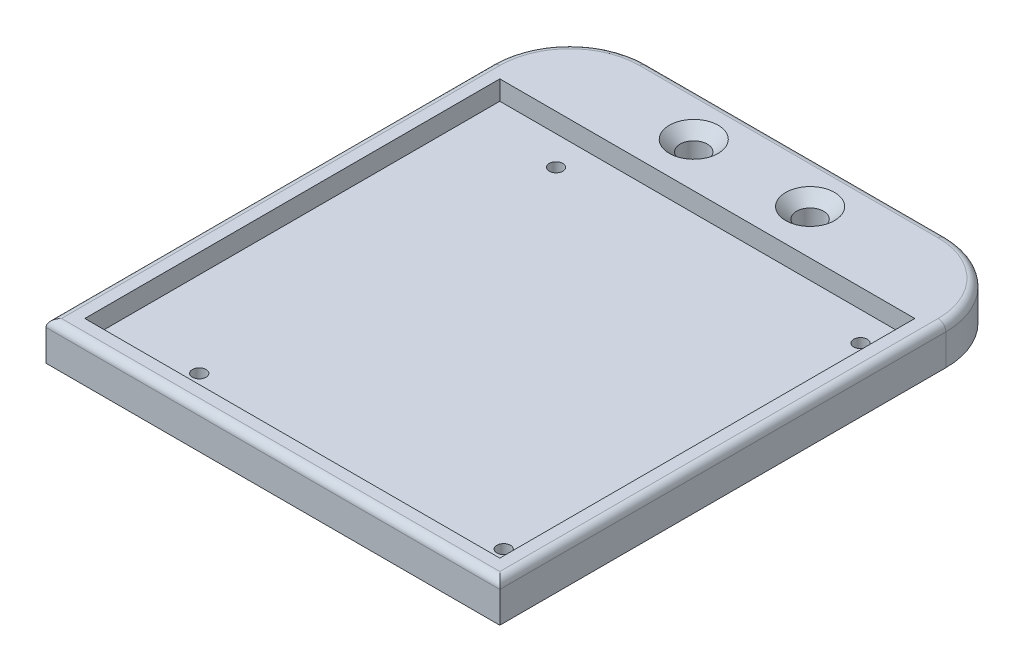
ISO-10303-21;
HEADER;
FILE_DESCRIPTION(('STEP AP214'),'2;1');
FILE_NAME('part.step','',(''),(''),'','','');
FILE_SCHEMA(('AUTOMOTIVE_DESIGN { 1 0 10303 214 1 1 1 1 }'));
ENDSEC;
DATA;
#1=APPLICATION_CONTEXT('core data for automotive mechanical design processes');
#2=APPLICATION_PROTOCOL_DEFINITION('international standard','automotive_design',2000,#1);
#3=PRODUCT_CONTEXT('',#1,'mechanical');
#4=PRODUCT('Part','Part','',(#3));
#5=PRODUCT_RELATED_PRODUCT_CATEGORY('part','',(#4));
#6=PRODUCT_DEFINITION_FORMATION('','',#4);
#7=PRODUCT_DEFINITION_CONTEXT('part definition',#1,'design');
#8=PRODUCT_DEFINITION('design','',#6,#7);
#9=PRODUCT_DEFINITION_SHAPE('','',#8);
#10=(LENGTH_UNIT() NAMED_UNIT(*) SI_UNIT(.MILLI.,.METRE.));
#11=(NAMED_UNIT(*) PLANE_ANGLE_UNIT() SI_UNIT($,.RADIAN.));
#12=(NAMED_UNIT(*) SI_UNIT($,.STERADIAN.) SOLID_ANGLE_UNIT());
#13=UNCERTAINTY_MEASURE_WITH_UNIT(LENGTH_MEASURE(1.E-05),#10,'distance_accuracy_value','');
#14=(GEOMETRIC_REPRESENTATION_CONTEXT(3) GLOBAL_UNCERTAINTY_ASSIGNED_CONTEXT((#13)) GLOBAL_UNIT_ASSIGNED_CONTEXT((#10,
#11,#12)) REPRESENTATION_CONTEXT('',''));
#15=CARTESIAN_POINT('',(0.,0.,0.));
#16=DIRECTION('',(0.,0.,1.));
#17=DIRECTION('',(1.,0.,0.));
#18=AXIS2_PLACEMENT_3D('',#15,#16,#17);
#19=CARTESIAN_POINT('',(58.5,10.,-67.5));
#20=DIRECTION('',(-1.,0.,0.));
#21=DIRECTION('',(0.,0.,1.));
#22=AXIS2_PLACEMENT_3D('',#19,#20,#21);
#23=PLANE('',#22);
#24=DIRECTION('',(0.,-1.,0.));
#25=VECTOR('',#24,1.);
#26=CARTESIAN_POINT('',(58.5,10.,-47.5));
#27=LINE('',#26,#25);
#28=CARTESIAN_POINT('',(58.5,0.,-47.5));
#29=VERTEX_POINT('',#28);
#30=CARTESIAN_POINT('',(58.5,8.,-47.5));
#31=VERTEX_POINT('',#30);
#32=EDGE_CURVE('E199',#29,#31,#27,.F.);
#33=ORIENTED_EDGE('',*,*,#32,.T.);
#34=DIRECTION('',(0.,0.,-1.));
#35=VECTOR('',#34,1.);
#36=CARTESIAN_POINT('',(58.5,8.,67.5));
#37=LINE('',#36,#35);
#38=CARTESIAN_POINT('',(58.5,8.,67.5));
#39=VERTEX_POINT('',#38);
#40=EDGE_CURVE('E217',#31,#39,#37,.F.);
#41=ORIENTED_EDGE('',*,*,#40,.T.);
#42=DIRECTION('',(0.,-1.,0.));
#43=VECTOR('',#42,1.);
#44=CARTESIAN_POINT('',(58.5,10.,67.5));
#45=LINE('',#44,#43);
#46=CARTESIAN_POINT('',(58.5,0.,67.5));
#47=VERTEX_POINT('',#46);
#48=EDGE_CURVE('E186',#39,#47,#45,.T.);
#49=ORIENTED_EDGE('',*,*,#48,.T.);
#50=DIRECTION('',(0.,0.,-1.));
#51=VECTOR('',#50,1.);
#52=CARTESIAN_POINT('',(58.5,0.,-67.5));
#53=LINE('',#52,#51);
#54=EDGE_CURVE('E171',#47,#29,#53,.T.);
#55=ORIENTED_EDGE('',*,*,#54,.T.);
#56=EDGE_LOOP('',(#33,#41,#49,#55));
#57=FACE_BOUND('',#56,.T.);
#58=ADVANCED_FACE('F33',(#57),#23,.F.);
#59=CARTESIAN_POINT('',(-58.5,10.,-67.5));
#60=DIRECTION('',(0.,0.,1.));
#61=DIRECTION('',(1.,0.,0.));
#62=AXIS2_PLACEMENT_3D('',#59,#60,#61);
#63=PLANE('',#62);
#64=DIRECTION('',(0.,-1.,0.));
#65=VECTOR('',#64,1.);
#66=CARTESIAN_POINT('',(-38.5,10.,-67.5));
#67=LINE('',#66,#65);
#68=CARTESIAN_POINT('',(-38.5,0.,-67.5));
#69=VERTEX_POINT('',#68);
#70=CARTESIAN_POINT('',(-38.5,8.,-67.5));
#71=VERTEX_POINT('',#70);
#72=EDGE_CURVE('E190',#69,#71,#67,.F.);
#73=ORIENTED_EDGE('',*,*,#72,.T.);
#74=DIRECTION('',(-1.,0.,0.));
#75=VECTOR('',#74,1.);
#76=CARTESIAN_POINT('',(38.5,8.,-67.5));
#77=LINE('',#76,#75);
#78=CARTESIAN_POINT('',(38.5,8.,-67.5));
#79=VERTEX_POINT('',#78);
#80=EDGE_CURVE('E222',#71,#79,#77,.F.);
#81=ORIENTED_EDGE('',*,*,#80,.T.);
#82=DIRECTION('',(0.,-1.,0.));
#83=VECTOR('',#82,1.);
#84=CARTESIAN_POINT('',(38.5,10.,-67.5));
#85=LINE('',#84,#83);
#86=CARTESIAN_POINT('',(38.5,0.,-67.5));
#87=VERTEX_POINT('',#86);
#88=EDGE_CURVE('E193',#79,#87,#85,.T.);
#89=ORIENTED_EDGE('',*,*,#88,.T.);
#90=DIRECTION('',(-1.,0.,0.));
#91=VECTOR('',#90,1.);
#92=CARTESIAN_POINT('',(-58.5,0.,-67.5));
#93=LINE('',#92,#91);
#94=EDGE_CURVE('E177',#87,#69,#93,.T.);
#95=ORIENTED_EDGE('',*,*,#94,.T.);
#96=EDGE_LOOP('',(#73,#81,#89,#95));
#97=FACE_BOUND('',#96,.T.);
#98=ADVANCED_FACE('F308',(#97),#63,.F.);
#99=CARTESIAN_POINT('',(-58.5,10.,-67.5));
#100=DIRECTION('',(1.,0.,0.));
#101=DIRECTION('',(0.,0.,-1.));
#102=AXIS2_PLACEMENT_3D('',#99,#100,#101);
#103=PLANE('',#102);
#104=DIRECTION('',(0.,-1.,0.));
#105=VECTOR('',#104,1.);
#106=CARTESIAN_POINT('',(-58.5,10.,67.5));
#107=LINE('',#106,#105);
#108=CARTESIAN_POINT('',(-58.5,8.,67.5));
#109=VERTEX_POINT('',#108);
#110=CARTESIAN_POINT('',(-58.5,0.,67.5));
#111=VERTEX_POINT('',#110);
#112=EDGE_CURVE('E188',#109,#111,#107,.T.);
#113=ORIENTED_EDGE('',*,*,#112,.F.);
#114=DIRECTION('',(0.,0.,1.));
#115=VECTOR('',#114,1.);
#116=CARTESIAN_POINT('',(-58.5,8.,-47.5));
#117=LINE('',#116,#115);
#118=CARTESIAN_POINT('',(-58.5,8.,-47.5));
#119=VERTEX_POINT('',#118);
#120=EDGE_CURVE('E11',#109,#119,#117,.F.);
#121=ORIENTED_EDGE('',*,*,#120,.T.);
#122=DIRECTION('',(0.,-1.,0.));
#123=VECTOR('',#122,1.);
#124=CARTESIAN_POINT('',(-58.5,10.,-47.5));
#125=LINE('',#124,#123);
#126=CARTESIAN_POINT('',(-58.5,0.,-47.5));
#127=VERTEX_POINT('',#126);
#128=EDGE_CURVE('E202',#119,#127,#125,.T.);
#129=ORIENTED_EDGE('',*,*,#128,.T.);
#130=DIRECTION('',(0.,0.,1.));
#131=VECTOR('',#130,1.);
#132=CARTESIAN_POINT('',(-58.5,0.,-67.5));
#133=LINE('',#132,#131);
#134=EDGE_CURVE('E180',#127,#111,#133,.T.);
#135=ORIENTED_EDGE('',*,*,#134,.T.);
#136=EDGE_LOOP('',(#113,#121,#129,#135));
#137=FACE_BOUND('',#136,.T.);
#138=ADVANCED_FACE('F314',(#137),#103,.F.);
#139=CARTESIAN_POINT('',(-58.5,10.,67.5));
#140=DIRECTION('',(0.,0.,-1.));
#141=DIRECTION('',(-1.,0.,0.));
#142=AXIS2_PLACEMENT_3D('',#139,#140,#141);
#143=PLANE('',#142);
#144=ORIENTED_EDGE('',*,*,#48,.F.);
#145=DIRECTION('',(1.,0.,0.));
#146=VECTOR('',#145,1.);
#147=CARTESIAN_POINT('',(-58.5,8.,67.5));
#148=LINE('',#147,#146);
#149=EDGE_CURVE('E42',#39,#109,#148,.F.);
#150=ORIENTED_EDGE('',*,*,#149,.T.);
#151=ORIENTED_EDGE('',*,*,#112,.T.);
#152=DIRECTION('',(1.,0.,0.));
#153=VECTOR('',#152,1.);
#154=CARTESIAN_POINT('',(-58.5,0.,67.5));
#155=LINE('',#154,#153);
#156=EDGE_CURVE('E183',#111,#47,#155,.T.);
#157=ORIENTED_EDGE('',*,*,#156,.T.);
#158=EDGE_LOOP('',(#144,#150,#151,#157));
#159=FACE_BOUND('',#158,.T.);
#160=ADVANCED_FACE('F365',(#159),#143,.F.);
#161=CARTESIAN_POINT('',(0.,10.,0.));
#162=DIRECTION('',(0.,1.,0.));
#163=DIRECTION('',(0.,0.,1.));
#164=AXIS2_PLACEMENT_3D('',#161,#162,#163);
#165=PLANE('',#164);
#166=DIRECTION('',(1.,0.,0.));
#167=VECTOR('',#166,1.);
#168=CARTESIAN_POINT('',(58.5,10.,65.5));
#169=LINE('',#168,#167);
#170=CARTESIAN_POINT('',(-56.5,10.,65.5));
#171=VERTEX_POINT('',#170);
#172=CARTESIAN_POINT('',(56.5,10.,65.5));
#173=VERTEX_POINT('',#172);
#174=EDGE_CURVE('E206',#171,#173,#169,.T.);
#175=ORIENTED_EDGE('',*,*,#174,.T.);
#176=DIRECTION('',(0.,0.,-1.));
#177=VECTOR('',#176,1.);
#178=CARTESIAN_POINT('',(56.5,10.,-47.5));
#179=LINE('',#178,#177);
#180=CARTESIAN_POINT('',(56.5,10.,-47.5));
#181=VERTEX_POINT('',#180);
#182=EDGE_CURVE('E214',#173,#181,#179,.T.);
#183=ORIENTED_EDGE('',*,*,#182,.T.);
#184=CARTESIAN_POINT('',(38.5,10.,-47.5));
#185=DIRECTION('',(0.,1.,0.));
#186=DIRECTION('',(0.,0.,1.));
#187=AXIS2_PLACEMENT_3D('',#184,#185,#186);
#188=CIRCLE('',#187,18.);
#189=CARTESIAN_POINT('',(38.5,10.,-65.5));
#190=VERTEX_POINT('',#189);
#191=EDGE_CURVE('E212',#181,#190,#188,.T.);
#192=ORIENTED_EDGE('',*,*,#191,.T.);
#193=DIRECTION('',(-1.,0.,0.));
#194=VECTOR('',#193,1.);
#195=CARTESIAN_POINT('',(-38.5,10.,-65.5));
#196=LINE('',#195,#194);
#197=CARTESIAN_POINT('',(-38.5,10.,-65.5));
#198=VERTEX_POINT('',#197);
#199=EDGE_CURVE('E210',#190,#198,#196,.T.);
#200=ORIENTED_EDGE('',*,*,#199,.T.);
#201=CARTESIAN_POINT('',(-38.5,10.,-47.5));
#202=DIRECTION('',(0.,1.,0.));
#203=DIRECTION('',(0.,0.,1.));
#204=AXIS2_PLACEMENT_3D('',#201,#202,#203);
#205=CIRCLE('',#204,18.);
#206=CARTESIAN_POINT('',(-56.5,10.,-47.5));
#207=VERTEX_POINT('',#206);
#208=EDGE_CURVE('E208',#198,#207,#205,.T.);
#209=ORIENTED_EDGE('',*,*,#208,.T.);
#210=DIRECTION('',(0.,0.,1.));
#211=VECTOR('',#210,1.);
#212=CARTESIAN_POINT('',(-56.5,10.,67.5));
#213=LINE('',#212,#211);
#214=EDGE_CURVE('E204',#207,#171,#213,.T.);
#215=ORIENTED_EDGE('',*,*,#214,.T.);
#216=EDGE_LOOP('',(#175,#183,#192,#200,#209,#215));
#217=FACE_BOUND('',#216,.T.);
#218=CARTESIAN_POINT('',(-15.,10.,-56.));
#219=DIRECTION('',(0.,1.,0.));
#220=DIRECTION('',(0.,0.,1.));
#221=AXIS2_PLACEMENT_3D('',#218,#219,#220);
#222=CIRCLE('',#221,6.3);
#223=CARTESIAN_POINT('',(-15.,10.,-49.7));
#224=VERTEX_POINT('',#223);
#225=EDGE_CURVE('E243',#224,#224,#222,.T.);
#226=ORIENTED_EDGE('',*,*,#225,.F.);
#227=EDGE_LOOP('',(#226));
#228=FACE_BOUND('',#227,.T.);
#229=CARTESIAN_POINT('',(15.,10.,-56.));
#230=DIRECTION('',(0.,1.,0.));
#231=DIRECTION('',(0.,0.,1.));
#232=AXIS2_PLACEMENT_3D('',#229,#230,#231);
#233=CIRCLE('',#232,6.3);
#234=CARTESIAN_POINT('',(15.,10.,-49.7));
#235=VERTEX_POINT('',#234);
#236=EDGE_CURVE('E258',#235,#235,#233,.T.);
#237=ORIENTED_EDGE('',*,*,#236,.F.);
#238=EDGE_LOOP('',(#237));
#239=FACE_BOUND('',#238,.T.);
#240=DIRECTION('',(0.,0.,-1.));
#241=VECTOR('',#240,1.);
#242=CARTESIAN_POINT('',(53.5,10.,-44.5));
#243=LINE('',#242,#241);
#244=CARTESIAN_POINT('',(53.5,10.,62.5));
#245=VERTEX_POINT('',#244);
#246=CARTESIAN_POINT('',(53.5,10.,-44.5));
#247=VERTEX_POINT('',#246);
#248=EDGE_CURVE('E135',#245,#247,#243,.T.);
#249=ORIENTED_EDGE('',*,*,#248,.F.);
#250=DIRECTION('',(1.,0.,0.));
#251=VECTOR('',#250,1.);
#252=CARTESIAN_POINT('',(-53.5,10.,62.5));
#253=LINE('',#252,#251);
#254=CARTESIAN_POINT('',(-53.5,10.,62.5));
#255=VERTEX_POINT('',#254);
#256=EDGE_CURVE('E152',#255,#245,#253,.T.);
#257=ORIENTED_EDGE('',*,*,#256,.F.);
#258=DIRECTION('',(0.,0.,1.));
#259=VECTOR('',#258,1.);
#260=CARTESIAN_POINT('',(-53.5,10.,-44.5));
#261=LINE('',#260,#259);
#262=CARTESIAN_POINT('',(-53.5,10.,-44.5));
#263=VERTEX_POINT('',#262);
#264=EDGE_CURVE('E155',#263,#255,#261,.T.);
#265=ORIENTED_EDGE('',*,*,#264,.F.);
#266=DIRECTION('',(-1.,0.,0.));
#267=VECTOR('',#266,1.);
#268=CARTESIAN_POINT('',(-53.5,10.,-44.5));
#269=LINE('',#268,#267);
#270=EDGE_CURVE('E164',#247,#263,#269,.T.);
#271=ORIENTED_EDGE('',*,*,#270,.F.);
#272=EDGE_LOOP('',(#249,#257,#265,#271));
#273=FACE_BOUND('',#272,.T.);
#274=ADVANCED_FACE('F372',(#217,#228,#239,#273),#165,.T.);
#275=CARTESIAN_POINT('',(0.,0.,0.));
#276=DIRECTION('',(0.,1.,0.));
#277=DIRECTION('',(0.,0.,1.));
#278=AXIS2_PLACEMENT_3D('',#275,#276,#277);
#279=PLANE('',#278);
#280=CARTESIAN_POINT('',(-15.,0.,-56.));
#281=DIRECTION('',(0.,1.,0.));
#282=DIRECTION('',(0.,0.,1.));
#283=AXIS2_PLACEMENT_3D('',#280,#281,#282);
#284=CIRCLE('',#283,3.5);
#285=CARTESIAN_POINT('',(-15.,0.,-52.5));
#286=VERTEX_POINT('',#285);
#287=EDGE_CURVE('E253',#286,#286,#284,.T.);
#288=ORIENTED_EDGE('',*,*,#287,.T.);
#289=EDGE_LOOP('',(#288));
#290=FACE_BOUND('',#289,.T.);
#291=CARTESIAN_POINT('',(15.,0.,-56.));
#292=DIRECTION('',(0.,1.,0.));
#293=DIRECTION('',(0.,0.,1.));
#294=AXIS2_PLACEMENT_3D('',#291,#292,#293);
#295=CIRCLE('',#294,3.5);
#296=CARTESIAN_POINT('',(15.,0.,-52.5));
#297=VERTEX_POINT('',#296);
#298=EDGE_CURVE('E264',#297,#297,#295,.T.);
#299=ORIENTED_EDGE('',*,*,#298,.T.);
#300=EDGE_LOOP('',(#299));
#301=FACE_BOUND('',#300,.T.);
#302=CARTESIAN_POINT('',(-31.5,0.,55.));
#303=DIRECTION('',(0.,1.,0.));
#304=DIRECTION('',(0.,0.,1.));
#305=AXIS2_PLACEMENT_3D('',#302,#303,#304);
#306=CIRCLE('',#305,1.75);
#307=CARTESIAN_POINT('',(-31.5,0.,56.75));
#308=VERTEX_POINT('',#307);
#309=EDGE_CURVE('E280',#308,#308,#306,.T.);
#310=ORIENTED_EDGE('',*,*,#309,.T.);
#311=EDGE_LOOP('',(#310));
#312=FACE_BOUND('',#311,.T.);
#313=CARTESIAN_POINT('',(47.,0.,55.));
#314=DIRECTION('',(0.,1.,0.));
#315=DIRECTION('',(0.,0.,1.));
#316=AXIS2_PLACEMENT_3D('',#313,#314,#315);
#317=CIRCLE('',#316,1.75);
#318=CARTESIAN_POINT('',(47.,0.,56.75));
#319=VERTEX_POINT('',#318);
#320=EDGE_CURVE('E274',#319,#319,#317,.T.);
#321=ORIENTED_EDGE('',*,*,#320,.T.);
#322=EDGE_LOOP('',(#321));
#323=FACE_BOUND('',#322,.T.);
#324=CARTESIAN_POINT('',(47.,0.,-37.));
#325=DIRECTION('',(0.,1.,0.));
#326=DIRECTION('',(0.,0.,1.));
#327=AXIS2_PLACEMENT_3D('',#324,#325,#326);
#328=CIRCLE('',#327,1.75);
#329=CARTESIAN_POINT('',(47.,0.,-35.25));
#330=VERTEX_POINT('',#329);
#331=EDGE_CURVE('E268',#330,#330,#328,.T.);
#332=ORIENTED_EDGE('',*,*,#331,.T.);
#333=EDGE_LOOP('',(#332));
#334=FACE_BOUND('',#333,.T.);
#335=CARTESIAN_POINT('',(-31.5,0.,-37.));
#336=DIRECTION('',(0.,1.,0.));
#337=DIRECTION('',(0.,0.,1.));
#338=AXIS2_PLACEMENT_3D('',#335,#336,#337);
#339=CIRCLE('',#338,1.75);
#340=CARTESIAN_POINT('',(-31.5,0.,-35.25));
#341=VERTEX_POINT('',#340);
#342=EDGE_CURVE('E165',#341,#341,#339,.T.);
#343=ORIENTED_EDGE('',*,*,#342,.T.);
#344=EDGE_LOOP('',(#343));
#345=FACE_BOUND('',#344,.T.);
#346=ORIENTED_EDGE('',*,*,#94,.F.);
#347=CARTESIAN_POINT('',(38.5,0.,-47.5));
#348=DIRECTION('',(0.,1.,0.));
#349=DIRECTION('',(0.,0.,1.));
#350=AXIS2_PLACEMENT_3D('',#347,#348,#349);
#351=CIRCLE('',#350,20.);
#352=EDGE_CURVE('E197',#87,#29,#351,.F.);
#353=ORIENTED_EDGE('',*,*,#352,.T.);
#354=ORIENTED_EDGE('',*,*,#54,.F.);
#355=ORIENTED_EDGE('',*,*,#156,.F.);
#356=ORIENTED_EDGE('',*,*,#134,.F.);
#357=CARTESIAN_POINT('',(-38.5,0.,-47.5));
#358=DIRECTION('',(0.,1.,0.));
#359=DIRECTION('',(0.,0.,1.));
#360=AXIS2_PLACEMENT_3D('',#357,#358,#359);
#361=CIRCLE('',#360,20.);
#362=EDGE_CURVE('E195',#127,#69,#361,.F.);
#363=ORIENTED_EDGE('',*,*,#362,.T.);
#364=EDGE_LOOP('',(#346,#353,#354,#355,#356,#363));
#365=FACE_BOUND('',#364,.T.);
#366=ADVANCED_FACE('F361',(#290,#301,#312,#323,#334,#345,#365),#279,.F.);
#367=CARTESIAN_POINT('',(53.5,5.,-44.5));
#368=DIRECTION('',(1.,0.,0.));
#369=DIRECTION('',(0.,0.,-1.));
#370=AXIS2_PLACEMENT_3D('',#367,#368,#369);
#371=PLANE('',#370);
#372=ORIENTED_EDGE('',*,*,#248,.T.);
#373=DIRECTION('',(0.,1.,0.));
#374=VECTOR('',#373,1.);
#375=CARTESIAN_POINT('',(53.5,5.,-44.5));
#376=LINE('',#375,#374);
#377=CARTESIAN_POINT('',(53.5,5.,-44.5));
#378=VERTEX_POINT('',#377);
#379=EDGE_CURVE('E128',#378,#247,#376,.T.);
#380=ORIENTED_EDGE('',*,*,#379,.F.);
#381=DIRECTION('',(0.,0.,-1.));
#382=VECTOR('',#381,1.);
#383=CARTESIAN_POINT('',(53.5,5.,-44.5));
#384=LINE('',#383,#382);
#385=CARTESIAN_POINT('',(53.5,5.,62.5));
#386=VERTEX_POINT('',#385);
#387=EDGE_CURVE('E132',#386,#378,#384,.T.);
#388=ORIENTED_EDGE('',*,*,#387,.F.);
#389=DIRECTION('',(0.,1.,0.));
#390=VECTOR('',#389,1.);
#391=CARTESIAN_POINT('',(53.5,5.,62.5));
#392=LINE('',#391,#390);
#393=EDGE_CURVE('E169',#386,#245,#392,.T.);
#394=ORIENTED_EDGE('',*,*,#393,.T.);
#395=EDGE_LOOP('',(#372,#380,#388,#394));
#396=FACE_BOUND('',#395,.T.);
#397=ADVANCED_FACE('F130',(#396),#371,.F.);
#398=CARTESIAN_POINT('',(-53.5,5.,62.5));
#399=DIRECTION('',(0.,0.,1.));
#400=DIRECTION('',(1.,0.,0.));
#401=AXIS2_PLACEMENT_3D('',#398,#399,#400);
#402=PLANE('',#401);
#403=ORIENTED_EDGE('',*,*,#256,.T.);
#404=ORIENTED_EDGE('',*,*,#393,.F.);
#405=DIRECTION('',(1.,0.,0.));
#406=VECTOR('',#405,1.);
#407=CARTESIAN_POINT('',(-53.5,5.,62.5));
#408=LINE('',#407,#406);
#409=CARTESIAN_POINT('',(-53.5,5.,62.5));
#410=VERTEX_POINT('',#409);
#411=EDGE_CURVE('E140',#410,#386,#408,.T.);
#412=ORIENTED_EDGE('',*,*,#411,.F.);
#413=DIRECTION('',(0.,1.,0.));
#414=VECTOR('',#413,1.);
#415=CARTESIAN_POINT('',(-53.5,5.,62.5));
#416=LINE('',#415,#414);
#417=EDGE_CURVE('E172',#410,#255,#416,.T.);
#418=ORIENTED_EDGE('',*,*,#417,.T.);
#419=EDGE_LOOP('',(#403,#404,#412,#418));
#420=FACE_BOUND('',#419,.T.);
#421=ADVANCED_FACE('F385',(#420),#402,.F.);
#422=CARTESIAN_POINT('',(-53.5,5.,-44.5));
#423=DIRECTION('',(-1.,0.,0.));
#424=DIRECTION('',(0.,0.,1.));
#425=AXIS2_PLACEMENT_3D('',#422,#423,#424);
#426=PLANE('',#425);
#427=ORIENTED_EDGE('',*,*,#264,.T.);
#428=ORIENTED_EDGE('',*,*,#417,.F.);
#429=DIRECTION('',(0.,0.,1.));
#430=VECTOR('',#429,1.);
#431=CARTESIAN_POINT('',(-53.5,5.,-44.5));
#432=LINE('',#431,#430);
#433=CARTESIAN_POINT('',(-53.5,5.,-44.5));
#434=VERTEX_POINT('',#433);
#435=EDGE_CURVE('E148',#434,#410,#432,.T.);
#436=ORIENTED_EDGE('',*,*,#435,.F.);
#437=DIRECTION('',(0.,1.,0.));
#438=VECTOR('',#437,1.);
#439=CARTESIAN_POINT('',(-53.5,5.,-44.5));
#440=LINE('',#439,#438);
#441=EDGE_CURVE('E139',#434,#263,#440,.T.);
#442=ORIENTED_EDGE('',*,*,#441,.T.);
#443=EDGE_LOOP('',(#427,#428,#436,#442));
#444=FACE_BOUND('',#443,.T.);
#445=ADVANCED_FACE('F302',(#444),#426,.F.);
#446=CARTESIAN_POINT('',(-53.5,5.,-44.5));
#447=DIRECTION('',(0.,0.,-1.));
#448=DIRECTION('',(-1.,0.,0.));
#449=AXIS2_PLACEMENT_3D('',#446,#447,#448);
#450=PLANE('',#449);
#451=ORIENTED_EDGE('',*,*,#270,.T.);
#452=ORIENTED_EDGE('',*,*,#441,.F.);
#453=DIRECTION('',(-1.,0.,0.));
#454=VECTOR('',#453,1.);
#455=CARTESIAN_POINT('',(-53.5,5.,-44.5));
#456=LINE('',#455,#454);
#457=EDGE_CURVE('E143',#378,#434,#456,.T.);
#458=ORIENTED_EDGE('',*,*,#457,.F.);
#459=ORIENTED_EDGE('',*,*,#379,.T.);
#460=EDGE_LOOP('',(#451,#452,#458,#459));
#461=FACE_BOUND('',#460,.T.);
#462=ADVANCED_FACE('F144',(#461),#450,.F.);
#463=CARTESIAN_POINT('',(0.,5.,0.));
#464=DIRECTION('',(0.,1.,0.));
#465=DIRECTION('',(0.,0.,1.));
#466=AXIS2_PLACEMENT_3D('',#463,#464,#465);
#467=PLANE('',#466);
#468=CARTESIAN_POINT('',(-31.5,5.,55.));
#469=DIRECTION('',(0.,1.,0.));
#470=DIRECTION('',(0.,0.,1.));
#471=AXIS2_PLACEMENT_3D('',#468,#469,#470);
#472=CIRCLE('',#471,1.75);
#473=CARTESIAN_POINT('',(-31.5,5.,56.75));
#474=VERTEX_POINT('',#473);
#475=EDGE_CURVE('E267',#474,#474,#472,.T.);
#476=ORIENTED_EDGE('',*,*,#475,.F.);
#477=EDGE_LOOP('',(#476));
#478=FACE_BOUND('',#477,.T.);
#479=CARTESIAN_POINT('',(47.,5.,55.));
#480=DIRECTION('',(0.,1.,0.));
#481=DIRECTION('',(0.,0.,1.));
#482=AXIS2_PLACEMENT_3D('',#479,#480,#481);
#483=CIRCLE('',#482,1.75);
#484=CARTESIAN_POINT('',(47.,5.,56.75));
#485=VERTEX_POINT('',#484);
#486=EDGE_CURVE('E277',#485,#485,#483,.T.);
#487=ORIENTED_EDGE('',*,*,#486,.F.);
#488=EDGE_LOOP('',(#487));
#489=FACE_BOUND('',#488,.T.);
#490=CARTESIAN_POINT('',(47.,5.,-37.));
#491=DIRECTION('',(0.,1.,0.));
#492=DIRECTION('',(0.,0.,1.));
#493=AXIS2_PLACEMENT_3D('',#490,#491,#492);
#494=CIRCLE('',#493,1.75);
#495=CARTESIAN_POINT('',(47.,5.,-35.25));
#496=VERTEX_POINT('',#495);
#497=EDGE_CURVE('E271',#496,#496,#494,.T.);
#498=ORIENTED_EDGE('',*,*,#497,.F.);
#499=EDGE_LOOP('',(#498));
#500=FACE_BOUND('',#499,.T.);
#501=CARTESIAN_POINT('',(-31.5,5.,-37.));
#502=DIRECTION('',(0.,1.,0.));
#503=DIRECTION('',(0.,0.,1.));
#504=AXIS2_PLACEMENT_3D('',#501,#502,#503);
#505=CIRCLE('',#504,1.75);
#506=CARTESIAN_POINT('',(-31.5,5.,-35.25));
#507=VERTEX_POINT('',#506);
#508=EDGE_CURVE('E158',#507,#507,#505,.T.);
#509=ORIENTED_EDGE('',*,*,#508,.F.);
#510=EDGE_LOOP('',(#509));
#511=FACE_BOUND('',#510,.T.);
#512=ORIENTED_EDGE('',*,*,#387,.T.);
#513=ORIENTED_EDGE('',*,*,#457,.T.);
#514=ORIENTED_EDGE('',*,*,#435,.T.);
#515=ORIENTED_EDGE('',*,*,#411,.T.);
#516=EDGE_LOOP('',(#512,#513,#514,#515));
#517=FACE_BOUND('',#516,.T.);
#518=ADVANCED_FACE('F150',(#478,#489,#500,#511,#517),#467,.T.);
#519=CARTESIAN_POINT('',(-31.5,0.,-37.));
#520=DIRECTION('',(0.,1.,0.));
#521=DIRECTION('',(0.,0.,1.));
#522=AXIS2_PLACEMENT_3D('',#519,#520,#521);
#523=CYLINDRICAL_SURFACE('',#522,1.75);
#524=ORIENTED_EDGE('',*,*,#342,.F.);
#525=EDGE_LOOP('',(#524));
#526=FACE_BOUND('',#525,.T.);
#527=ORIENTED_EDGE('',*,*,#508,.T.);
#528=EDGE_LOOP('',(#527));
#529=FACE_BOUND('',#528,.T.);
#530=ADVANCED_FACE('F290',(#526,#529),#523,.F.);
#531=CARTESIAN_POINT('',(47.,0.,-37.));
#532=DIRECTION('',(0.,1.,0.));
#533=DIRECTION('',(0.,0.,1.));
#534=AXIS2_PLACEMENT_3D('',#531,#532,#533);
#535=CYLINDRICAL_SURFACE('',#534,1.75);
#536=ORIENTED_EDGE('',*,*,#331,.F.);
#537=EDGE_LOOP('',(#536));
#538=FACE_BOUND('',#537,.T.);
#539=ORIENTED_EDGE('',*,*,#497,.T.);
#540=EDGE_LOOP('',(#539));
#541=FACE_BOUND('',#540,.T.);
#542=ADVANCED_FACE('F299',(#538,#541),#535,.F.);
#543=CARTESIAN_POINT('',(47.,0.,55.));
#544=DIRECTION('',(0.,1.,0.));
#545=DIRECTION('',(0.,0.,1.));
#546=AXIS2_PLACEMENT_3D('',#543,#544,#545);
#547=CYLINDRICAL_SURFACE('',#546,1.75);
#548=ORIENTED_EDGE('',*,*,#320,.F.);
#549=EDGE_LOOP('',(#548));
#550=FACE_BOUND('',#549,.T.);
#551=ORIENTED_EDGE('',*,*,#486,.T.);
#552=EDGE_LOOP('',(#551));
#553=FACE_BOUND('',#552,.T.);
#554=ADVANCED_FACE('F456',(#550,#553),#547,.F.);
#555=CARTESIAN_POINT('',(-31.5,0.,55.));
#556=DIRECTION('',(0.,1.,0.));
#557=DIRECTION('',(0.,0.,1.));
#558=AXIS2_PLACEMENT_3D('',#555,#556,#557);
#559=CYLINDRICAL_SURFACE('',#558,1.75);
#560=ORIENTED_EDGE('',*,*,#309,.F.);
#561=EDGE_LOOP('',(#560));
#562=FACE_BOUND('',#561,.T.);
#563=ORIENTED_EDGE('',*,*,#475,.T.);
#564=EDGE_LOOP('',(#563));
#565=FACE_BOUND('',#564,.T.);
#566=ADVANCED_FACE('F466',(#562,#565),#559,.F.);
#567=CARTESIAN_POINT('',(15.,10.,-56.));
#568=DIRECTION('',(0.,1.,0.));
#569=DIRECTION('',(0.,0.,1.));
#570=AXIS2_PLACEMENT_3D('',#567,#568,#569);
#571=CYLINDRICAL_SURFACE('',#570,3.5);
#572=ORIENTED_EDGE('',*,*,#298,.F.);
#573=EDGE_LOOP('',(#572));
#574=FACE_BOUND('',#573,.T.);
#575=CARTESIAN_POINT('',(15.,7.2,-56.));
#576=DIRECTION('',(0.,1.,0.));
#577=DIRECTION('',(0.,0.,1.));
#578=AXIS2_PLACEMENT_3D('',#575,#576,#577);
#579=CIRCLE('',#578,3.5);
#580=CARTESIAN_POINT('',(15.,7.2,-52.5));
#581=VERTEX_POINT('',#580);
#582=EDGE_CURVE('E261',#581,#581,#579,.T.);
#583=ORIENTED_EDGE('',*,*,#582,.T.);
#584=EDGE_LOOP('',(#583));
#585=FACE_BOUND('',#584,.T.);
#586=ADVANCED_FACE('F476',(#574,#585),#571,.F.);
#587=CARTESIAN_POINT('',(15.,10.,-56.));
#588=DIRECTION('',(0.,1.,0.));
#589=DIRECTION('',(0.,0.,1.));
#590=AXIS2_PLACEMENT_3D('',#587,#588,#589);
#591=CONICAL_SURFACE('',#590,6.3,0.785398163397449);
#592=ORIENTED_EDGE('',*,*,#582,.F.);
#593=EDGE_LOOP('',(#592));
#594=FACE_BOUND('',#593,.T.);
#595=ORIENTED_EDGE('',*,*,#236,.T.);
#596=EDGE_LOOP('',(#595));
#597=FACE_BOUND('',#596,.T.);
#598=ADVANCED_FACE('F486',(#594,#597),#591,.F.);
#599=CARTESIAN_POINT('',(-15.,10.,-56.));
#600=DIRECTION('',(0.,1.,0.));
#601=DIRECTION('',(0.,0.,1.));
#602=AXIS2_PLACEMENT_3D('',#599,#600,#601);
#603=CYLINDRICAL_SURFACE('',#602,3.5);
#604=ORIENTED_EDGE('',*,*,#287,.F.);
#605=EDGE_LOOP('',(#604));
#606=FACE_BOUND('',#605,.T.);
#607=CARTESIAN_POINT('',(-15.,7.2,-56.));
#608=DIRECTION('',(0.,1.,0.));
#609=DIRECTION('',(0.,0.,1.));
#610=AXIS2_PLACEMENT_3D('',#607,#608,#609);
#611=CIRCLE('',#610,3.5);
#612=CARTESIAN_POINT('',(-15.,7.2,-52.5));
#613=VERTEX_POINT('',#612);
#614=EDGE_CURVE('E248',#613,#613,#611,.T.);
#615=ORIENTED_EDGE('',*,*,#614,.T.);
#616=EDGE_LOOP('',(#615));
#617=FACE_BOUND('',#616,.T.);
#618=ADVANCED_FACE('F496',(#606,#617),#603,.F.);
#619=CARTESIAN_POINT('',(-15.,10.,-56.));
#620=DIRECTION('',(0.,1.,0.));
#621=DIRECTION('',(0.,0.,1.));
#622=AXIS2_PLACEMENT_3D('',#619,#620,#621);
#623=CONICAL_SURFACE('',#622,6.3,0.785398163397449);
#624=ORIENTED_EDGE('',*,*,#614,.F.);
#625=EDGE_LOOP('',(#624));
#626=FACE_BOUND('',#625,.T.);
#627=ORIENTED_EDGE('',*,*,#225,.T.);
#628=EDGE_LOOP('',(#627));
#629=FACE_BOUND('',#628,.T.);
#630=ADVANCED_FACE('F323',(#626,#629),#623,.F.);
#631=CARTESIAN_POINT('',(38.5,10.,-47.5));
#632=DIRECTION('',(0.,-1.,0.));
#633=DIRECTION('',(0.,0.,-1.));
#634=AXIS2_PLACEMENT_3D('',#631,#632,#633);
#635=CYLINDRICAL_SURFACE('',#634,20.);
#636=ORIENTED_EDGE('',*,*,#88,.F.);
#637=CARTESIAN_POINT('',(38.5,8.,-47.5));
#638=DIRECTION('',(0.,1.,0.));
#639=DIRECTION('',(0.,0.,1.));
#640=AXIS2_PLACEMENT_3D('',#637,#638,#639);
#641=CIRCLE('',#640,20.);
#642=EDGE_CURVE('E220',#79,#31,#641,.F.);
#643=ORIENTED_EDGE('',*,*,#642,.T.);
#644=ORIENTED_EDGE('',*,*,#32,.F.);
#645=ORIENTED_EDGE('',*,*,#352,.F.);
#646=EDGE_LOOP('',(#636,#643,#644,#645));
#647=FACE_BOUND('',#646,.T.);
#648=ADVANCED_FACE('F319',(#647),#635,.T.);
#649=CARTESIAN_POINT('',(-38.5,10.,-47.5));
#650=DIRECTION('',(0.,-1.,0.));
#651=DIRECTION('',(0.,0.,-1.));
#652=AXIS2_PLACEMENT_3D('',#649,#650,#651);
#653=CYLINDRICAL_SURFACE('',#652,20.);
#654=ORIENTED_EDGE('',*,*,#128,.F.);
#655=CARTESIAN_POINT('',(-38.5,8.,-47.5));
#656=DIRECTION('',(0.,1.,0.));
#657=DIRECTION('',(0.,0.,1.));
#658=AXIS2_PLACEMENT_3D('',#655,#656,#657);
#659=CIRCLE('',#658,20.);
#660=EDGE_CURVE('E224',#119,#71,#659,.F.);
#661=ORIENTED_EDGE('',*,*,#660,.T.);
#662=ORIENTED_EDGE('',*,*,#72,.F.);
#663=ORIENTED_EDGE('',*,*,#362,.F.);
#664=EDGE_LOOP('',(#654,#661,#662,#663));
#665=FACE_BOUND('',#664,.T.);
#666=ADVANCED_FACE('F322',(#665),#653,.T.);
#667=CARTESIAN_POINT('',(-38.5,8.,-47.5));
#668=DIRECTION('',(0.,1.,0.));
#669=DIRECTION('',(0.,0.,1.));
#670=AXIS2_PLACEMENT_3D('',#667,#668,#669);
#671=TOROIDAL_SURFACE('',#670,18.,2.);
#672=CARTESIAN_POINT('',(-38.5,8.,-65.5));
#673=DIRECTION('',(1.,0.,0.));
#674=DIRECTION('',(0.,0.,-1.));
#675=AXIS2_PLACEMENT_3D('',#672,#673,#674);
#676=CIRCLE('',#675,2.);
#677=EDGE_CURVE('E236',#71,#198,#676,.T.);
#678=ORIENTED_EDGE('',*,*,#677,.F.);
#679=ORIENTED_EDGE('',*,*,#660,.F.);
#680=CARTESIAN_POINT('',(-56.5,8.,-47.5));
#681=DIRECTION('',(0.,0.,1.));
#682=DIRECTION('',(1.,0.,0.));
#683=AXIS2_PLACEMENT_3D('',#680,#681,#682);
#684=CIRCLE('',#683,2.);
#685=EDGE_CURVE('E37',#207,#119,#684,.T.);
#686=ORIENTED_EDGE('',*,*,#685,.F.);
#687=ORIENTED_EDGE('',*,*,#208,.F.);
#688=EDGE_LOOP('',(#678,#679,#686,#687));
#689=FACE_BOUND('',#688,.T.);
#690=ADVANCED_FACE('F35',(#689),#671,.T.);
#691=CARTESIAN_POINT('',(-56.5,8.,0.));
#692=DIRECTION('',(0.,0.,-1.));
#693=DIRECTION('',(-1.,0.,0.));
#694=AXIS2_PLACEMENT_3D('',#691,#692,#693);
#695=CYLINDRICAL_SURFACE('',#694,2.);
#696=ORIENTED_EDGE('',*,*,#685,.T.);
#697=ORIENTED_EDGE('',*,*,#120,.F.);
#698=CARTESIAN_POINT('',(-56.5,8.,65.5));
#699=DIRECTION('',(-0.707106781186547,0.,-0.707106781186547));
#700=DIRECTION('',(0.707106781186547,0.,-0.707106781186548));
#701=AXIS2_PLACEMENT_3D('',#698,#699,#700);
#702=ELLIPSE('',#701,2.82842712474619,2.);
#703=EDGE_CURVE('E234',#171,#109,#702,.F.);
#704=ORIENTED_EDGE('',*,*,#703,.F.);
#705=ORIENTED_EDGE('',*,*,#214,.F.);
#706=EDGE_LOOP('',(#696,#697,#704,#705));
#707=FACE_BOUND('',#706,.T.);
#708=ADVANCED_FACE('F342',(#707),#695,.T.);
#709=CARTESIAN_POINT('',(0.,8.,-65.5));
#710=DIRECTION('',(1.,0.,0.));
#711=DIRECTION('',(0.,0.,-1.));
#712=AXIS2_PLACEMENT_3D('',#709,#710,#711);
#713=CYLINDRICAL_SURFACE('',#712,2.);
#714=ORIENTED_EDGE('',*,*,#677,.T.);
#715=ORIENTED_EDGE('',*,*,#199,.F.);
#716=CARTESIAN_POINT('',(38.5,8.,-65.5));
#717=DIRECTION('',(1.,0.,0.));
#718=DIRECTION('',(0.,0.,-1.));
#719=AXIS2_PLACEMENT_3D('',#716,#717,#718);
#720=CIRCLE('',#719,2.);
#721=EDGE_CURVE('E231',#79,#190,#720,.T.);
#722=ORIENTED_EDGE('',*,*,#721,.F.);
#723=ORIENTED_EDGE('',*,*,#80,.F.);
#724=EDGE_LOOP('',(#714,#715,#722,#723));
#725=FACE_BOUND('',#724,.T.);
#726=ADVANCED_FACE('F339',(#725),#713,.T.);
#727=CARTESIAN_POINT('',(0.,8.,65.5));
#728=DIRECTION('',(-1.,0.,0.));
#729=DIRECTION('',(0.,0.,1.));
#730=AXIS2_PLACEMENT_3D('',#727,#728,#729);
#731=CYLINDRICAL_SURFACE('',#730,2.);
#732=ORIENTED_EDGE('',*,*,#703,.T.);
#733=ORIENTED_EDGE('',*,*,#149,.F.);
#734=CARTESIAN_POINT('',(56.5,8.,65.5));
#735=DIRECTION('',(-0.707106781186547,0.,0.707106781186548));
#736=DIRECTION('',(-0.707106781186547,0.,-0.707106781186547));
#737=AXIS2_PLACEMENT_3D('',#734,#735,#736);
#738=ELLIPSE('',#737,2.82842712474619,2.);
#739=EDGE_CURVE('E229',#173,#39,#738,.F.);
#740=ORIENTED_EDGE('',*,*,#739,.F.);
#741=ORIENTED_EDGE('',*,*,#174,.F.);
#742=EDGE_LOOP('',(#732,#733,#740,#741));
#743=FACE_BOUND('',#742,.T.);
#744=ADVANCED_FACE('F335',(#743),#731,.T.);
#745=CARTESIAN_POINT('',(38.5,8.,-47.5));
#746=DIRECTION('',(0.,1.,0.));
#747=DIRECTION('',(0.,0.,1.));
#748=AXIS2_PLACEMENT_3D('',#745,#746,#747);
#749=TOROIDAL_SURFACE('',#748,18.,2.);
#750=ORIENTED_EDGE('',*,*,#721,.T.);
#751=ORIENTED_EDGE('',*,*,#191,.F.);
#752=CARTESIAN_POINT('',(56.5,8.,-47.5));
#753=DIRECTION('',(0.,0.,1.));
#754=DIRECTION('',(1.,0.,0.));
#755=AXIS2_PLACEMENT_3D('',#752,#753,#754);
#756=CIRCLE('',#755,2.);
#757=EDGE_CURVE('E227',#31,#181,#756,.T.);
#758=ORIENTED_EDGE('',*,*,#757,.F.);
#759=ORIENTED_EDGE('',*,*,#642,.F.);
#760=EDGE_LOOP('',(#750,#751,#758,#759));
#761=FACE_BOUND('',#760,.T.);
#762=ADVANCED_FACE('F331',(#761),#749,.T.);
#763=CARTESIAN_POINT('',(56.5,8.,0.));
#764=DIRECTION('',(0.,0.,1.));
#765=DIRECTION('',(1.,0.,0.));
#766=AXIS2_PLACEMENT_3D('',#763,#764,#765);
#767=CYLINDRICAL_SURFACE('',#766,2.);
#768=ORIENTED_EDGE('',*,*,#739,.T.);
#769=ORIENTED_EDGE('',*,*,#40,.F.);
#770=ORIENTED_EDGE('',*,*,#757,.T.);
#771=ORIENTED_EDGE('',*,*,#182,.F.);
#772=EDGE_LOOP('',(#768,#769,#770,#771));
#773=FACE_BOUND('',#772,.T.);
#774=ADVANCED_FACE('F328',(#773),#767,.T.);
#775=CLOSED_SHELL('',(#58,#98,#138,#160,#274,#366,#397,#421,#445,#462,#518,#530,#542,#554,#566,
#586,#598,#618,#630,#648,#666,#690,#708,#726,#744,#762,#774));
#776=MANIFOLD_SOLID_BREP('B2',#775);
#777=ADVANCED_BREP_SHAPE_REPRESENTATION('',(#18,#776),#14);
#778=SHAPE_DEFINITION_REPRESENTATION(#9,#777);
ENDSEC;
END-ISO-10303-21;
